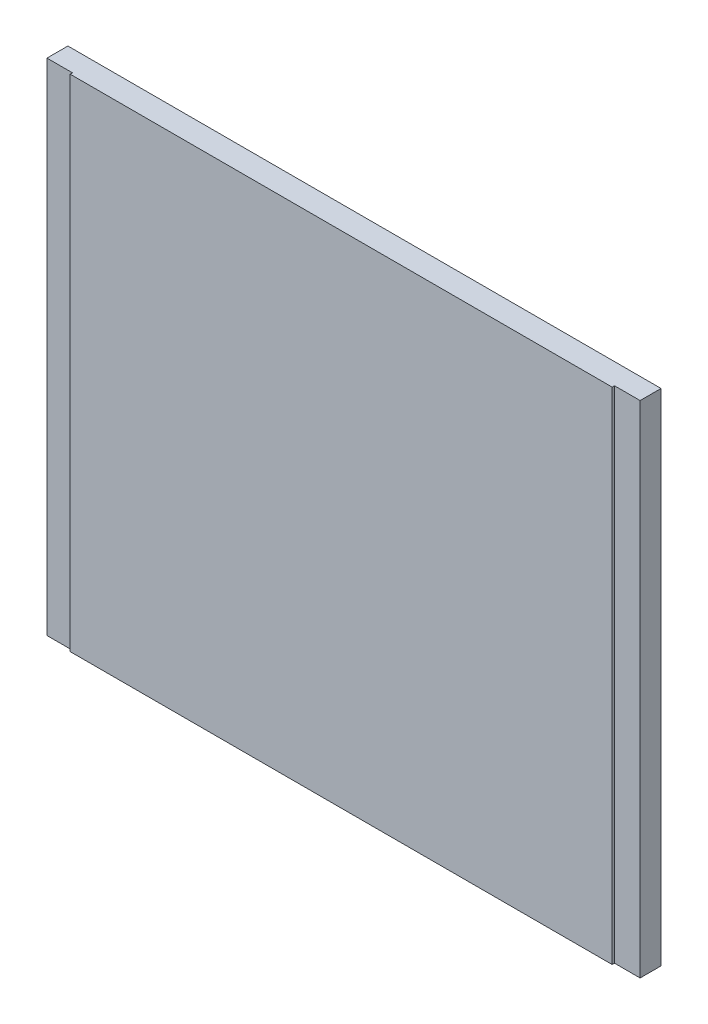
ISO-10303-21;
HEADER;
FILE_DESCRIPTION(('STEP AP214'),'2;1');
FILE_NAME('part.step','',(''),(''),'','','');
FILE_SCHEMA(('AUTOMOTIVE_DESIGN { 1 0 10303 214 1 1 1 1 }'));
ENDSEC;
DATA;
#1=APPLICATION_CONTEXT('core data for automotive mechanical design processes');
#2=APPLICATION_PROTOCOL_DEFINITION('international standard','automotive_design',2000,#1);
#3=PRODUCT_CONTEXT('',#1,'mechanical');
#4=PRODUCT('Part','Part','',(#3));
#5=PRODUCT_RELATED_PRODUCT_CATEGORY('part','',(#4));
#6=PRODUCT_DEFINITION_FORMATION('','',#4);
#7=PRODUCT_DEFINITION_CONTEXT('part definition',#1,'design');
#8=PRODUCT_DEFINITION('design','',#6,#7);
#9=PRODUCT_DEFINITION_SHAPE('','',#8);
#10=(LENGTH_UNIT() NAMED_UNIT(*) SI_UNIT(.MILLI.,.METRE.));
#11=(NAMED_UNIT(*) PLANE_ANGLE_UNIT() SI_UNIT($,.RADIAN.));
#12=(NAMED_UNIT(*) SI_UNIT($,.STERADIAN.) SOLID_ANGLE_UNIT());
#13=UNCERTAINTY_MEASURE_WITH_UNIT(LENGTH_MEASURE(1.E-05),#10,'distance_accuracy_value','');
#14=(GEOMETRIC_REPRESENTATION_CONTEXT(3) GLOBAL_UNCERTAINTY_ASSIGNED_CONTEXT((#13)) GLOBAL_UNIT_ASSIGNED_CONTEXT((#10,
#11,#12)) REPRESENTATION_CONTEXT('',''));
#15=CARTESIAN_POINT('',(0.,0.,0.));
#16=DIRECTION('',(0.,0.,1.));
#17=DIRECTION('',(1.,0.,0.));
#18=AXIS2_PLACEMENT_3D('',#15,#16,#17);
#19=CARTESIAN_POINT('',(127.5,107.5,10.));
#20=DIRECTION('',(-1.,0.,0.));
#21=DIRECTION('',(0.,0.,1.));
#22=AXIS2_PLACEMENT_3D('',#19,#20,#21);
#23=PLANE('',#22);
#24=DIRECTION('',(0.,1.,0.));
#25=VECTOR('',#24,1.);
#26=CARTESIAN_POINT('',(127.5,0.,9.));
#27=LINE('',#26,#25);
#28=CARTESIAN_POINT('',(127.5,-107.5,9.));
#29=VERTEX_POINT('',#28);
#30=CARTESIAN_POINT('',(127.5,107.5,9.));
#31=VERTEX_POINT('',#30);
#32=EDGE_CURVE('E139',#29,#31,#27,.T.);
#33=ORIENTED_EDGE('',*,*,#32,.F.);
#34=DIRECTION('',(0.,0.,-1.));
#35=VECTOR('',#34,1.);
#36=CARTESIAN_POINT('',(127.5,-107.5,10.));
#37=LINE('',#36,#35);
#38=CARTESIAN_POINT('',(127.5,-107.5,0.));
#39=VERTEX_POINT('',#38);
#40=EDGE_CURVE('E151',#29,#39,#37,.T.);
#41=ORIENTED_EDGE('',*,*,#40,.T.);
#42=DIRECTION('',(0.,1.,0.));
#43=VECTOR('',#42,1.);
#44=CARTESIAN_POINT('',(127.5,107.5,0.));
#45=LINE('',#44,#43);
#46=CARTESIAN_POINT('',(127.5,107.5,0.));
#47=VERTEX_POINT('',#46);
#48=EDGE_CURVE('E128',#39,#47,#45,.T.);
#49=ORIENTED_EDGE('',*,*,#48,.T.);
#50=DIRECTION('',(0.,0.,-1.));
#51=VECTOR('',#50,1.);
#52=CARTESIAN_POINT('',(127.5,107.5,10.));
#53=LINE('',#52,#51);
#54=EDGE_CURVE('E11',#31,#47,#53,.T.);
#55=ORIENTED_EDGE('',*,*,#54,.F.);
#56=EDGE_LOOP('',(#33,#41,#49,#55));
#57=FACE_BOUND('',#56,.T.);
#58=ADVANCED_FACE('F39',(#57),#23,.F.);
#59=CARTESIAN_POINT('',(-127.5,107.5,10.));
#60=DIRECTION('',(0.,-1.,0.));
#61=DIRECTION('',(0.,0.,-1.));
#62=AXIS2_PLACEMENT_3D('',#59,#60,#61);
#63=PLANE('',#62);
#64=DIRECTION('',(0.,0.,1.));
#65=VECTOR('',#64,1.);
#66=CARTESIAN_POINT('',(-116.5,107.5,9.));
#67=LINE('',#66,#65);
#68=CARTESIAN_POINT('',(-116.5,107.5,9.));
#69=VERTEX_POINT('',#68);
#70=CARTESIAN_POINT('',(-116.5,107.5,10.));
#71=VERTEX_POINT('',#70);
#72=EDGE_CURVE('E100',#69,#71,#67,.T.);
#73=ORIENTED_EDGE('',*,*,#72,.T.);
#74=DIRECTION('',(-1.,0.,0.));
#75=VECTOR('',#74,1.);
#76=CARTESIAN_POINT('',(-127.5,107.5,10.));
#77=LINE('',#76,#75);
#78=CARTESIAN_POINT('',(116.5,107.5,10.));
#79=VERTEX_POINT('',#78);
#80=EDGE_CURVE('E145',#79,#71,#77,.T.);
#81=ORIENTED_EDGE('',*,*,#80,.F.);
#82=DIRECTION('',(0.,0.,1.));
#83=VECTOR('',#82,1.);
#84=CARTESIAN_POINT('',(116.5,107.5,9.));
#85=LINE('',#84,#83);
#86=CARTESIAN_POINT('',(116.5,107.5,9.));
#87=VERTEX_POINT('',#86);
#88=EDGE_CURVE('E61',#87,#79,#85,.T.);
#89=ORIENTED_EDGE('',*,*,#88,.F.);
#90=DIRECTION('',(-1.,0.,0.));
#91=VECTOR('',#90,1.);
#92=CARTESIAN_POINT('',(0.,107.5,9.));
#93=LINE('',#92,#91);
#94=EDGE_CURVE('E130',#31,#87,#93,.T.);
#95=ORIENTED_EDGE('',*,*,#94,.F.);
#96=ORIENTED_EDGE('',*,*,#54,.T.);
#97=DIRECTION('',(-1.,0.,0.));
#98=VECTOR('',#97,1.);
#99=CARTESIAN_POINT('',(-127.5,107.5,0.));
#100=LINE('',#99,#98);
#101=CARTESIAN_POINT('',(-127.5,107.5,0.));
#102=VERTEX_POINT('',#101);
#103=EDGE_CURVE('E154',#47,#102,#100,.T.);
#104=ORIENTED_EDGE('',*,*,#103,.T.);
#105=DIRECTION('',(0.,0.,-1.));
#106=VECTOR('',#105,1.);
#107=CARTESIAN_POINT('',(-127.5,107.5,10.));
#108=LINE('',#107,#106);
#109=CARTESIAN_POINT('',(-127.5,107.5,9.));
#110=VERTEX_POINT('',#109);
#111=EDGE_CURVE('E46',#110,#102,#108,.T.);
#112=ORIENTED_EDGE('',*,*,#111,.F.);
#113=DIRECTION('',(-1.,0.,0.));
#114=VECTOR('',#113,1.);
#115=CARTESIAN_POINT('',(0.,107.5,9.));
#116=LINE('',#115,#114);
#117=EDGE_CURVE('E114',#69,#110,#116,.T.);
#118=ORIENTED_EDGE('',*,*,#117,.F.);
#119=EDGE_LOOP('',(#73,#81,#89,#95,#96,#104,#112,#118));
#120=FACE_BOUND('',#119,.T.);
#121=ADVANCED_FACE('F119',(#120),#63,.F.);
#122=CARTESIAN_POINT('',(-127.5,107.5,10.));
#123=DIRECTION('',(1.,0.,0.));
#124=DIRECTION('',(0.,1.,0.));
#125=AXIS2_PLACEMENT_3D('',#122,#123,#124);
#126=PLANE('',#125);
#127=DIRECTION('',(0.,-1.,0.));
#128=VECTOR('',#127,1.);
#129=CARTESIAN_POINT('',(-127.5,0.,9.));
#130=LINE('',#129,#128);
#131=CARTESIAN_POINT('',(-127.5,-107.5,9.));
#132=VERTEX_POINT('',#131);
#133=EDGE_CURVE('E121',#110,#132,#130,.T.);
#134=ORIENTED_EDGE('',*,*,#133,.F.);
#135=ORIENTED_EDGE('',*,*,#111,.T.);
#136=DIRECTION('',(0.,-1.,0.));
#137=VECTOR('',#136,1.);
#138=CARTESIAN_POINT('',(-127.5,107.5,0.));
#139=LINE('',#138,#137);
#140=CARTESIAN_POINT('',(-127.5,-107.5,0.));
#141=VERTEX_POINT('',#140);
#142=EDGE_CURVE('E156',#102,#141,#139,.T.);
#143=ORIENTED_EDGE('',*,*,#142,.T.);
#144=DIRECTION('',(0.,0.,-1.));
#145=VECTOR('',#144,1.);
#146=CARTESIAN_POINT('',(-127.5,-107.5,10.));
#147=LINE('',#146,#145);
#148=EDGE_CURVE('E162',#132,#141,#147,.T.);
#149=ORIENTED_EDGE('',*,*,#148,.F.);
#150=EDGE_LOOP('',(#134,#135,#143,#149));
#151=FACE_BOUND('',#150,.T.);
#152=ADVANCED_FACE('F164',(#151),#126,.F.);
#153=CARTESIAN_POINT('',(-127.5,-107.5,10.));
#154=DIRECTION('',(0.,1.,0.));
#155=DIRECTION('',(0.,0.,1.));
#156=AXIS2_PLACEMENT_3D('',#153,#154,#155);
#157=PLANE('',#156);
#158=DIRECTION('',(0.,0.,1.));
#159=VECTOR('',#158,1.);
#160=CARTESIAN_POINT('',(-116.5,-107.5,9.));
#161=LINE('',#160,#159);
#162=CARTESIAN_POINT('',(-116.5,-107.5,9.));
#163=VERTEX_POINT('',#162);
#164=CARTESIAN_POINT('',(-116.5,-107.5,10.));
#165=VERTEX_POINT('',#164);
#166=EDGE_CURVE('E53',#163,#165,#161,.T.);
#167=ORIENTED_EDGE('',*,*,#166,.F.);
#168=DIRECTION('',(1.,0.,0.));
#169=VECTOR('',#168,1.);
#170=CARTESIAN_POINT('',(0.,-107.5,9.));
#171=LINE('',#170,#169);
#172=EDGE_CURVE('E110',#132,#163,#171,.T.);
#173=ORIENTED_EDGE('',*,*,#172,.F.);
#174=ORIENTED_EDGE('',*,*,#148,.T.);
#175=DIRECTION('',(1.,0.,0.));
#176=VECTOR('',#175,1.);
#177=CARTESIAN_POINT('',(-127.5,-107.5,0.));
#178=LINE('',#177,#176);
#179=EDGE_CURVE('E148',#141,#39,#178,.T.);
#180=ORIENTED_EDGE('',*,*,#179,.T.);
#181=ORIENTED_EDGE('',*,*,#40,.F.);
#182=DIRECTION('',(1.,0.,0.));
#183=VECTOR('',#182,1.);
#184=CARTESIAN_POINT('',(0.,-107.5,9.));
#185=LINE('',#184,#183);
#186=CARTESIAN_POINT('',(116.5,-107.5,9.));
#187=VERTEX_POINT('',#186);
#188=EDGE_CURVE('E137',#187,#29,#185,.T.);
#189=ORIENTED_EDGE('',*,*,#188,.F.);
#190=DIRECTION('',(0.,0.,1.));
#191=VECTOR('',#190,1.);
#192=CARTESIAN_POINT('',(116.5,-107.5,9.));
#193=LINE('',#192,#191);
#194=CARTESIAN_POINT('',(116.5,-107.5,10.));
#195=VERTEX_POINT('',#194);
#196=EDGE_CURVE('E127',#187,#195,#193,.T.);
#197=ORIENTED_EDGE('',*,*,#196,.T.);
#198=DIRECTION('',(1.,0.,0.));
#199=VECTOR('',#198,1.);
#200=CARTESIAN_POINT('',(-127.5,-107.5,10.));
#201=LINE('',#200,#199);
#202=EDGE_CURVE('E147',#165,#195,#201,.T.);
#203=ORIENTED_EDGE('',*,*,#202,.F.);
#204=EDGE_LOOP('',(#167,#173,#174,#180,#181,#189,#197,#203));
#205=FACE_BOUND('',#204,.T.);
#206=ADVANCED_FACE('F176',(#205),#157,.F.);
#207=CARTESIAN_POINT('',(0.,0.,10.));
#208=DIRECTION('',(0.,0.,1.));
#209=DIRECTION('',(1.,0.,0.));
#210=AXIS2_PLACEMENT_3D('',#207,#208,#209);
#211=PLANE('',#210);
#212=ORIENTED_EDGE('',*,*,#80,.T.);
#213=DIRECTION('',(0.,-1.,0.));
#214=VECTOR('',#213,1.);
#215=CARTESIAN_POINT('',(-116.5,0.,10.));
#216=LINE('',#215,#214);
#217=EDGE_CURVE('E105',#71,#165,#216,.T.);
#218=ORIENTED_EDGE('',*,*,#217,.T.);
#219=ORIENTED_EDGE('',*,*,#202,.T.);
#220=DIRECTION('',(0.,-1.,0.));
#221=VECTOR('',#220,1.);
#222=CARTESIAN_POINT('',(116.5,0.,10.));
#223=LINE('',#222,#221);
#224=EDGE_CURVE('E134',#79,#195,#223,.T.);
#225=ORIENTED_EDGE('',*,*,#224,.F.);
#226=EDGE_LOOP('',(#212,#218,#219,#225));
#227=FACE_BOUND('',#226,.T.);
#228=ADVANCED_FACE('F180',(#227),#211,.T.);
#229=CARTESIAN_POINT('',(0.,0.,0.));
#230=DIRECTION('',(0.,0.,1.));
#231=DIRECTION('',(1.,0.,0.));
#232=AXIS2_PLACEMENT_3D('',#229,#230,#231);
#233=PLANE('',#232);
#234=ORIENTED_EDGE('',*,*,#48,.F.);
#235=ORIENTED_EDGE('',*,*,#179,.F.);
#236=ORIENTED_EDGE('',*,*,#142,.F.);
#237=ORIENTED_EDGE('',*,*,#103,.F.);
#238=EDGE_LOOP('',(#234,#235,#236,#237));
#239=FACE_BOUND('',#238,.T.);
#240=ADVANCED_FACE('F173',(#239),#233,.F.);
#241=CARTESIAN_POINT('',(116.5,0.,9.));
#242=DIRECTION('',(-1.,0.,0.));
#243=DIRECTION('',(0.,0.,1.));
#244=AXIS2_PLACEMENT_3D('',#241,#242,#243);
#245=PLANE('',#244);
#246=ORIENTED_EDGE('',*,*,#224,.T.);
#247=ORIENTED_EDGE('',*,*,#196,.F.);
#248=DIRECTION('',(0.,-1.,0.));
#249=VECTOR('',#248,1.);
#250=CARTESIAN_POINT('',(116.5,0.,9.));
#251=LINE('',#250,#249);
#252=EDGE_CURVE('E133',#87,#187,#251,.T.);
#253=ORIENTED_EDGE('',*,*,#252,.F.);
#254=ORIENTED_EDGE('',*,*,#88,.T.);
#255=EDGE_LOOP('',(#246,#247,#253,#254));
#256=FACE_BOUND('',#255,.T.);
#257=ADVANCED_FACE('F185',(#256),#245,.F.);
#258=CARTESIAN_POINT('',(0.,0.,9.));
#259=DIRECTION('',(0.,0.,1.));
#260=DIRECTION('',(1.,0.,0.));
#261=AXIS2_PLACEMENT_3D('',#258,#259,#260);
#262=PLANE('',#261);
#263=ORIENTED_EDGE('',*,*,#94,.T.);
#264=ORIENTED_EDGE('',*,*,#252,.T.);
#265=ORIENTED_EDGE('',*,*,#188,.T.);
#266=ORIENTED_EDGE('',*,*,#32,.T.);
#267=EDGE_LOOP('',(#263,#264,#265,#266));
#268=FACE_BOUND('',#267,.T.);
#269=ADVANCED_FACE('F184',(#268),#262,.T.);
#270=CARTESIAN_POINT('',(-116.5,0.,9.));
#271=DIRECTION('',(-1.,0.,0.));
#272=DIRECTION('',(0.,0.,1.));
#273=AXIS2_PLACEMENT_3D('',#270,#271,#272);
#274=PLANE('',#273);
#275=ORIENTED_EDGE('',*,*,#217,.F.);
#276=ORIENTED_EDGE('',*,*,#72,.F.);
#277=DIRECTION('',(0.,-1.,0.));
#278=VECTOR('',#277,1.);
#279=CARTESIAN_POINT('',(-116.5,0.,9.));
#280=LINE('',#279,#278);
#281=EDGE_CURVE('E103',#69,#163,#280,.T.);
#282=ORIENTED_EDGE('',*,*,#281,.T.);
#283=ORIENTED_EDGE('',*,*,#166,.T.);
#284=EDGE_LOOP('',(#275,#276,#282,#283));
#285=FACE_BOUND('',#284,.T.);
#286=ADVANCED_FACE('F102',(#285),#274,.T.);
#287=CARTESIAN_POINT('',(0.,0.,9.));
#288=DIRECTION('',(0.,0.,1.));
#289=DIRECTION('',(1.,0.,0.));
#290=AXIS2_PLACEMENT_3D('',#287,#288,#289);
#291=PLANE('',#290);
#292=ORIENTED_EDGE('',*,*,#281,.F.);
#293=ORIENTED_EDGE('',*,*,#117,.T.);
#294=ORIENTED_EDGE('',*,*,#133,.T.);
#295=ORIENTED_EDGE('',*,*,#172,.T.);
#296=EDGE_LOOP('',(#292,#293,#294,#295));
#297=FACE_BOUND('',#296,.T.);
#298=ADVANCED_FACE('F113',(#297),#291,.T.);
#299=CLOSED_SHELL('',(#58,#121,#152,#206,#228,#240,#257,#269,#286,#298));
#300=MANIFOLD_SOLID_BREP('B2',#299);
#301=ADVANCED_BREP_SHAPE_REPRESENTATION('',(#18,#300),#14);
#302=SHAPE_DEFINITION_REPRESENTATION(#9,#301);
ENDSEC;
END-ISO-10303-21;
